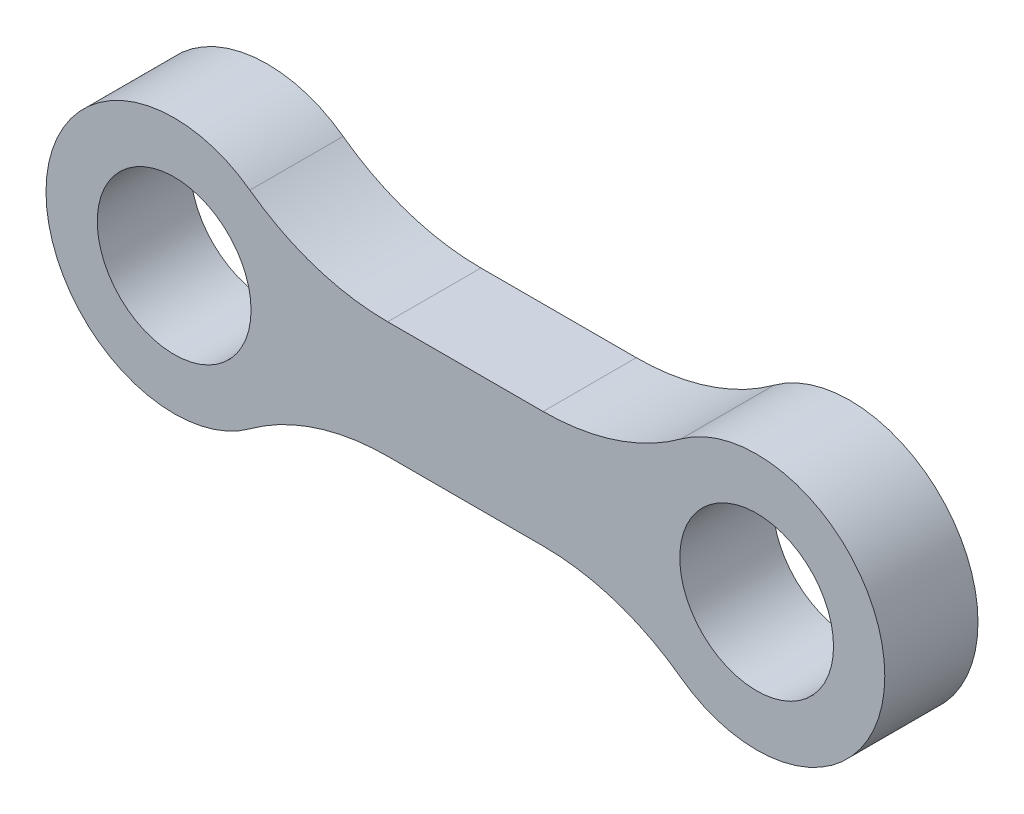
ISO-10303-21;
HEADER;
FILE_DESCRIPTION(('STEP AP214'),'2;1');
FILE_NAME('part.step','',(''),(''),'','','');
FILE_SCHEMA(('AUTOMOTIVE_DESIGN { 1 0 10303 214 1 1 1 1 }'));
ENDSEC;
DATA;
#1=APPLICATION_CONTEXT('core data for automotive mechanical design processes');
#2=APPLICATION_PROTOCOL_DEFINITION('international standard','automotive_design',2000,#1);
#3=PRODUCT_CONTEXT('',#1,'mechanical');
#4=PRODUCT('Part','Part','',(#3));
#5=PRODUCT_RELATED_PRODUCT_CATEGORY('part','',(#4));
#6=PRODUCT_DEFINITION_FORMATION('','',#4);
#7=PRODUCT_DEFINITION_CONTEXT('part definition',#1,'design');
#8=PRODUCT_DEFINITION('design','',#6,#7);
#9=PRODUCT_DEFINITION_SHAPE('','',#8);
#10=(LENGTH_UNIT() NAMED_UNIT(*) SI_UNIT(.MILLI.,.METRE.));
#11=(NAMED_UNIT(*) PLANE_ANGLE_UNIT() SI_UNIT($,.RADIAN.));
#12=(NAMED_UNIT(*) SI_UNIT($,.STERADIAN.) SOLID_ANGLE_UNIT());
#13=UNCERTAINTY_MEASURE_WITH_UNIT(LENGTH_MEASURE(1.E-05),#10,'distance_accuracy_value','');
#14=(GEOMETRIC_REPRESENTATION_CONTEXT(3) GLOBAL_UNCERTAINTY_ASSIGNED_CONTEXT((#13)) GLOBAL_UNIT_ASSIGNED_CONTEXT((#10,
#11,#12)) REPRESENTATION_CONTEXT('',''));
#15=CARTESIAN_POINT('',(0.,0.,0.));
#16=DIRECTION('',(0.,0.,1.));
#17=DIRECTION('',(1.,0.,0.));
#18=AXIS2_PLACEMENT_3D('',#15,#16,#17);
#19=CARTESIAN_POINT('',(-2.5,2.5,-4.));
#20=DIRECTION('',(0.,0.,1.));
#21=DIRECTION('',(1.,0.,0.));
#22=AXIS2_PLACEMENT_3D('',#19,#20,#21);
#23=CYLINDRICAL_SURFACE('',#22,5.5);
#24=CARTESIAN_POINT('',(-2.5,2.5,0.));
#25=DIRECTION('',(0.,0.,1.));
#26=DIRECTION('',(1.,0.,0.));
#27=AXIS2_PLACEMENT_3D('',#24,#25,#26);
#28=CIRCLE('',#27,5.5);
#29=CARTESIAN_POINT('',(-5.75215049319447,-1.93548387096774,0.));
#30=VERTEX_POINT('',#29);
#31=CARTESIAN_POINT('',(-5.75215049319447,6.93548387096774,0.));
#32=VERTEX_POINT('',#31);
#33=EDGE_CURVE('E215',#30,#32,#28,.T.);
#34=ORIENTED_EDGE('',*,*,#33,.F.);
#35=DIRECTION('',(0.,0.,1.));
#36=VECTOR('',#35,1.);
#37=CARTESIAN_POINT('',(-5.75215049319447,-1.93548387096774,-4.));
#38=LINE('',#37,#36);
#39=CARTESIAN_POINT('',(-5.75215049319447,-1.93548387096774,-4.));
#40=VERTEX_POINT('',#39);
#41=EDGE_CURVE('E112',#30,#40,#38,.F.);
#42=ORIENTED_EDGE('',*,*,#41,.T.);
#43=CARTESIAN_POINT('',(-2.5,2.5,-4.));
#44=DIRECTION('',(0.,0.,1.));
#45=DIRECTION('',(1.,0.,0.));
#46=AXIS2_PLACEMENT_3D('',#43,#44,#45);
#47=CIRCLE('',#46,5.5);
#48=CARTESIAN_POINT('',(-5.75215049319447,6.93548387096774,-4.));
#49=VERTEX_POINT('',#48);
#50=EDGE_CURVE('E197',#40,#49,#47,.T.);
#51=ORIENTED_EDGE('',*,*,#50,.T.);
#52=DIRECTION('',(0.,0.,1.));
#53=VECTOR('',#52,1.);
#54=CARTESIAN_POINT('',(-5.75215049319447,6.93548387096774,-4.));
#55=LINE('',#54,#53);
#56=EDGE_CURVE('E129',#49,#32,#55,.T.);
#57=ORIENTED_EDGE('',*,*,#56,.T.);
#58=EDGE_LOOP('',(#34,#42,#51,#57));
#59=FACE_BOUND('',#58,.T.);
#60=ADVANCED_FACE('F41',(#59),#23,.T.);
#61=CARTESIAN_POINT('',(0.,0.,-4.));
#62=DIRECTION('',(0.,1.,0.));
#63=DIRECTION('',(-1.,0.,0.));
#64=AXIS2_PLACEMENT_3D('',#61,#62,#63);
#65=PLANE('',#64);
#66=DIRECTION('',(-1.,0.,0.));
#67=VECTOR('',#66,1.);
#68=CARTESIAN_POINT('',(0.,0.,-4.));
#69=LINE('',#68,#67);
#70=CARTESIAN_POINT('',(-11.6651513899117,0.,-4.));
#71=VERTEX_POINT('',#70);
#72=CARTESIAN_POINT('',(-18.3348486100883,0.,-4.));
#73=VERTEX_POINT('',#72);
#74=EDGE_CURVE('E127',#71,#73,#69,.T.);
#75=ORIENTED_EDGE('',*,*,#74,.F.);
#76=DIRECTION('',(0.,0.,1.));
#77=VECTOR('',#76,1.);
#78=CARTESIAN_POINT('',(-11.6651513899117,0.,-4.));
#79=LINE('',#78,#77);
#80=CARTESIAN_POINT('',(-11.6651513899117,0.,0.));
#81=VERTEX_POINT('',#80);
#82=EDGE_CURVE('E111',#71,#81,#79,.T.);
#83=ORIENTED_EDGE('',*,*,#82,.T.);
#84=DIRECTION('',(-1.,0.,0.));
#85=VECTOR('',#84,1.);
#86=CARTESIAN_POINT('',(0.,0.,0.));
#87=LINE('',#86,#85);
#88=CARTESIAN_POINT('',(-18.3348486100883,0.,0.));
#89=VERTEX_POINT('',#88);
#90=EDGE_CURVE('E124',#81,#89,#87,.T.);
#91=ORIENTED_EDGE('',*,*,#90,.T.);
#92=DIRECTION('',(0.,0.,1.));
#93=VECTOR('',#92,1.);
#94=CARTESIAN_POINT('',(-18.3348486100883,0.,-4.));
#95=LINE('',#94,#93);
#96=EDGE_CURVE('E130',#89,#73,#95,.F.);
#97=ORIENTED_EDGE('',*,*,#96,.T.);
#98=EDGE_LOOP('',(#75,#83,#91,#97));
#99=FACE_BOUND('',#98,.T.);
#100=ADVANCED_FACE('F123',(#99),#65,.F.);
#101=CARTESIAN_POINT('',(-27.5,2.49999999999999,-4.));
#102=DIRECTION('',(0.,0.,1.));
#103=DIRECTION('',(1.,0.,0.));
#104=AXIS2_PLACEMENT_3D('',#101,#102,#103);
#105=CYLINDRICAL_SURFACE('',#104,5.5);
#106=CARTESIAN_POINT('',(-27.5,2.49999999999999,-4.));
#107=DIRECTION('',(0.,0.,1.));
#108=DIRECTION('',(1.,0.,0.));
#109=AXIS2_PLACEMENT_3D('',#106,#107,#108);
#110=CIRCLE('',#109,5.5);
#111=CARTESIAN_POINT('',(-24.2478495068055,6.93548387096774,-4.));
#112=VERTEX_POINT('',#111);
#113=CARTESIAN_POINT('',(-24.2478495068055,-1.93548387096774,-4.));
#114=VERTEX_POINT('',#113);
#115=EDGE_CURVE('E196',#112,#114,#110,.T.);
#116=ORIENTED_EDGE('',*,*,#115,.T.);
#117=DIRECTION('',(0.,0.,1.));
#118=VECTOR('',#117,1.);
#119=CARTESIAN_POINT('',(-24.2478495068055,-1.93548387096774,-4.));
#120=LINE('',#119,#118);
#121=CARTESIAN_POINT('',(-24.2478495068055,-1.93548387096774,0.));
#122=VERTEX_POINT('',#121);
#123=EDGE_CURVE('E160',#114,#122,#120,.T.);
#124=ORIENTED_EDGE('',*,*,#123,.T.);
#125=CARTESIAN_POINT('',(-27.5,2.49999999999999,0.));
#126=DIRECTION('',(0.,0.,1.));
#127=DIRECTION('',(1.,0.,0.));
#128=AXIS2_PLACEMENT_3D('',#125,#126,#127);
#129=CIRCLE('',#128,5.5);
#130=CARTESIAN_POINT('',(-24.2478495068055,6.93548387096774,0.));
#131=VERTEX_POINT('',#130);
#132=EDGE_CURVE('E138',#131,#122,#129,.T.);
#133=ORIENTED_EDGE('',*,*,#132,.F.);
#134=DIRECTION('',(0.,0.,1.));
#135=VECTOR('',#134,1.);
#136=CARTESIAN_POINT('',(-24.2478495068055,6.93548387096774,-4.));
#137=LINE('',#136,#135);
#138=EDGE_CURVE('E157',#131,#112,#137,.F.);
#139=ORIENTED_EDGE('',*,*,#138,.T.);
#140=EDGE_LOOP('',(#116,#124,#133,#139));
#141=FACE_BOUND('',#140,.T.);
#142=ADVANCED_FACE('F190',(#141),#105,.T.);
#143=CARTESIAN_POINT('',(0.,5.,-4.));
#144=DIRECTION('',(0.,1.,0.));
#145=DIRECTION('',(0.,0.,1.));
#146=AXIS2_PLACEMENT_3D('',#143,#144,#145);
#147=PLANE('',#146);
#148=DIRECTION('',(-1.,0.,0.));
#149=VECTOR('',#148,1.);
#150=CARTESIAN_POINT('',(0.,5.,0.));
#151=LINE('',#150,#149);
#152=CARTESIAN_POINT('',(-11.6651513899117,5.,0.));
#153=VERTEX_POINT('',#152);
#154=CARTESIAN_POINT('',(-18.3348486100883,5.,0.));
#155=VERTEX_POINT('',#154);
#156=EDGE_CURVE('E145',#153,#155,#151,.T.);
#157=ORIENTED_EDGE('',*,*,#156,.F.);
#158=DIRECTION('',(0.,0.,-1.));
#159=VECTOR('',#158,1.);
#160=CARTESIAN_POINT('',(-11.6651513899117,5.,-4.));
#161=LINE('',#160,#159);
#162=CARTESIAN_POINT('',(-11.6651513899117,5.,-4.));
#163=VERTEX_POINT('',#162);
#164=EDGE_CURVE('E62',#153,#163,#161,.T.);
#165=ORIENTED_EDGE('',*,*,#164,.T.);
#166=DIRECTION('',(-1.,0.,0.));
#167=VECTOR('',#166,1.);
#168=CARTESIAN_POINT('',(0.,5.,-4.));
#169=LINE('',#168,#167);
#170=CARTESIAN_POINT('',(-18.3348486100883,5.,-4.));
#171=VERTEX_POINT('',#170);
#172=EDGE_CURVE('E193',#163,#171,#169,.T.);
#173=ORIENTED_EDGE('',*,*,#172,.T.);
#174=DIRECTION('',(0.,0.,-1.));
#175=VECTOR('',#174,1.);
#176=CARTESIAN_POINT('',(-18.3348486100883,5.,0.));
#177=LINE('',#176,#175);
#178=EDGE_CURVE('E164',#171,#155,#177,.F.);
#179=ORIENTED_EDGE('',*,*,#178,.T.);
#180=EDGE_LOOP('',(#157,#165,#173,#179));
#181=FACE_BOUND('',#180,.T.);
#182=ADVANCED_FACE('F192',(#181),#147,.T.);
#183=CARTESIAN_POINT('',(-27.5,2.49999999999999,-4.));
#184=DIRECTION('',(0.,0.,1.));
#185=DIRECTION('',(1.,0.,0.));
#186=AXIS2_PLACEMENT_3D('',#183,#184,#185);
#187=CYLINDRICAL_SURFACE('',#186,3.3);
#188=CARTESIAN_POINT('',(-27.5,2.49999999999999,-4.));
#189=DIRECTION('',(0.,0.,1.));
#190=DIRECTION('',(1.,0.,0.));
#191=AXIS2_PLACEMENT_3D('',#188,#189,#190);
#192=CIRCLE('',#191,3.3);
#193=CARTESIAN_POINT('',(-24.2,2.49999999999999,-4.));
#194=VERTEX_POINT('',#193);
#195=EDGE_CURVE('E143',#194,#194,#192,.T.);
#196=ORIENTED_EDGE('',*,*,#195,.F.);
#197=EDGE_LOOP('',(#196));
#198=FACE_BOUND('',#197,.T.);
#199=CARTESIAN_POINT('',(-27.5,2.49999999999999,0.));
#200=DIRECTION('',(0.,0.,1.));
#201=DIRECTION('',(1.,0.,0.));
#202=AXIS2_PLACEMENT_3D('',#199,#200,#201);
#203=CIRCLE('',#202,3.3);
#204=CARTESIAN_POINT('',(-24.2,2.49999999999999,0.));
#205=VERTEX_POINT('',#204);
#206=EDGE_CURVE('E211',#205,#205,#203,.T.);
#207=ORIENTED_EDGE('',*,*,#206,.T.);
#208=EDGE_LOOP('',(#207));
#209=FACE_BOUND('',#208,.T.);
#210=ADVANCED_FACE('F244',(#198,#209),#187,.F.);
#211=CARTESIAN_POINT('',(-2.5,2.5,-4.));
#212=DIRECTION('',(0.,0.,1.));
#213=DIRECTION('',(1.,0.,0.));
#214=AXIS2_PLACEMENT_3D('',#211,#212,#213);
#215=CYLINDRICAL_SURFACE('',#214,3.3);
#216=CARTESIAN_POINT('',(-2.5,2.5,-4.));
#217=DIRECTION('',(0.,0.,1.));
#218=DIRECTION('',(1.,0.,0.));
#219=AXIS2_PLACEMENT_3D('',#216,#217,#218);
#220=CIRCLE('',#219,3.3);
#221=CARTESIAN_POINT('',(0.8,2.5,-4.));
#222=VERTEX_POINT('',#221);
#223=EDGE_CURVE('E150',#222,#222,#220,.T.);
#224=ORIENTED_EDGE('',*,*,#223,.F.);
#225=EDGE_LOOP('',(#224));
#226=FACE_BOUND('',#225,.T.);
#227=CARTESIAN_POINT('',(-2.5,2.5,0.));
#228=DIRECTION('',(0.,0.,1.));
#229=DIRECTION('',(1.,0.,0.));
#230=AXIS2_PLACEMENT_3D('',#227,#228,#229);
#231=CIRCLE('',#230,3.3);
#232=CARTESIAN_POINT('',(0.8,2.5,0.));
#233=VERTEX_POINT('',#232);
#234=EDGE_CURVE('E137',#233,#233,#231,.T.);
#235=ORIENTED_EDGE('',*,*,#234,.T.);
#236=EDGE_LOOP('',(#235));
#237=FACE_BOUND('',#236,.T.);
#238=ADVANCED_FACE('F246',(#226,#237),#215,.F.);
#239=CARTESIAN_POINT('',(0.,0.,-4.));
#240=DIRECTION('',(0.,0.,1.));
#241=DIRECTION('',(1.,0.,0.));
#242=AXIS2_PLACEMENT_3D('',#239,#240,#241);
#243=PLANE('',#242);
#244=ORIENTED_EDGE('',*,*,#195,.T.);
#245=EDGE_LOOP('',(#244));
#246=FACE_BOUND('',#245,.T.);
#247=ORIENTED_EDGE('',*,*,#50,.F.);
#248=CARTESIAN_POINT('',(-11.6651513899117,-10.,-4.));
#249=DIRECTION('',(0.,0.,1.));
#250=DIRECTION('',(1.,0.,0.));
#251=AXIS2_PLACEMENT_3D('',#248,#249,#250);
#252=CIRCLE('',#251,10.);
#253=EDGE_CURVE('E118',#40,#71,#252,.T.);
#254=ORIENTED_EDGE('',*,*,#253,.T.);
#255=ORIENTED_EDGE('',*,*,#74,.T.);
#256=CARTESIAN_POINT('',(-18.3348486100883,-10.,-4.));
#257=DIRECTION('',(0.,0.,1.));
#258=DIRECTION('',(1.,0.,0.));
#259=AXIS2_PLACEMENT_3D('',#256,#257,#258);
#260=CIRCLE('',#259,10.);
#261=EDGE_CURVE('E174',#73,#114,#260,.T.);
#262=ORIENTED_EDGE('',*,*,#261,.T.);
#263=ORIENTED_EDGE('',*,*,#115,.F.);
#264=CARTESIAN_POINT('',(-18.3348486100883,15.,-4.));
#265=DIRECTION('',(0.,0.,1.));
#266=DIRECTION('',(1.,0.,0.));
#267=AXIS2_PLACEMENT_3D('',#264,#265,#266);
#268=CIRCLE('',#267,10.);
#269=EDGE_CURVE('E11',#112,#171,#268,.T.);
#270=ORIENTED_EDGE('',*,*,#269,.T.);
#271=ORIENTED_EDGE('',*,*,#172,.F.);
#272=CARTESIAN_POINT('',(-11.6651513899117,15.,-4.));
#273=DIRECTION('',(0.,0.,1.));
#274=DIRECTION('',(1.,0.,0.));
#275=AXIS2_PLACEMENT_3D('',#272,#273,#274);
#276=CIRCLE('',#275,10.);
#277=EDGE_CURVE('E180',#163,#49,#276,.T.);
#278=ORIENTED_EDGE('',*,*,#277,.T.);
#279=EDGE_LOOP('',(#247,#254,#255,#262,#263,#270,#271,#278));
#280=FACE_BOUND('',#279,.T.);
#281=ORIENTED_EDGE('',*,*,#223,.T.);
#282=EDGE_LOOP('',(#281));
#283=FACE_BOUND('',#282,.T.);
#284=ADVANCED_FACE('F223',(#246,#280,#283),#243,.F.);
#285=CARTESIAN_POINT('',(0.,0.,0.));
#286=DIRECTION('',(0.,0.,1.));
#287=DIRECTION('',(1.,0.,0.));
#288=AXIS2_PLACEMENT_3D('',#285,#286,#287);
#289=PLANE('',#288);
#290=ORIENTED_EDGE('',*,*,#206,.F.);
#291=EDGE_LOOP('',(#290));
#292=FACE_BOUND('',#291,.T.);
#293=ORIENTED_EDGE('',*,*,#90,.F.);
#294=CARTESIAN_POINT('',(-11.6651513899117,-10.,0.));
#295=DIRECTION('',(0.,0.,1.));
#296=DIRECTION('',(1.,0.,0.));
#297=AXIS2_PLACEMENT_3D('',#294,#295,#296);
#298=CIRCLE('',#297,10.);
#299=EDGE_CURVE('E107',#81,#30,#298,.F.);
#300=ORIENTED_EDGE('',*,*,#299,.T.);
#301=ORIENTED_EDGE('',*,*,#33,.T.);
#302=CARTESIAN_POINT('',(-11.6651513899117,15.,0.));
#303=DIRECTION('',(0.,0.,1.));
#304=DIRECTION('',(1.,0.,0.));
#305=AXIS2_PLACEMENT_3D('',#302,#303,#304);
#306=CIRCLE('',#305,10.);
#307=EDGE_CURVE('E177',#32,#153,#306,.F.);
#308=ORIENTED_EDGE('',*,*,#307,.T.);
#309=ORIENTED_EDGE('',*,*,#156,.T.);
#310=CARTESIAN_POINT('',(-18.3348486100883,15.,0.));
#311=DIRECTION('',(0.,0.,1.));
#312=DIRECTION('',(1.,0.,0.));
#313=AXIS2_PLACEMENT_3D('',#310,#311,#312);
#314=CIRCLE('',#313,10.);
#315=EDGE_CURVE('E50',#155,#131,#314,.F.);
#316=ORIENTED_EDGE('',*,*,#315,.T.);
#317=ORIENTED_EDGE('',*,*,#132,.T.);
#318=CARTESIAN_POINT('',(-18.3348486100883,-10.,0.));
#319=DIRECTION('',(0.,0.,1.));
#320=DIRECTION('',(1.,0.,0.));
#321=AXIS2_PLACEMENT_3D('',#318,#319,#320);
#322=CIRCLE('',#321,10.);
#323=EDGE_CURVE('E135',#122,#89,#322,.F.);
#324=ORIENTED_EDGE('',*,*,#323,.T.);
#325=EDGE_LOOP('',(#293,#300,#301,#308,#309,#316,#317,#324));
#326=FACE_BOUND('',#325,.T.);
#327=ORIENTED_EDGE('',*,*,#234,.F.);
#328=EDGE_LOOP('',(#327));
#329=FACE_BOUND('',#328,.T.);
#330=ADVANCED_FACE('F132',(#292,#326,#329),#289,.T.);
#331=CARTESIAN_POINT('',(-11.6651513899117,-10.,-4.));
#332=DIRECTION('',(0.,0.,1.));
#333=DIRECTION('',(1.,0.,0.));
#334=AXIS2_PLACEMENT_3D('',#331,#332,#333);
#335=CYLINDRICAL_SURFACE('',#334,10.);
#336=ORIENTED_EDGE('',*,*,#253,.F.);
#337=ORIENTED_EDGE('',*,*,#41,.F.);
#338=ORIENTED_EDGE('',*,*,#299,.F.);
#339=ORIENTED_EDGE('',*,*,#82,.F.);
#340=EDGE_LOOP('',(#336,#337,#338,#339));
#341=FACE_BOUND('',#340,.T.);
#342=ADVANCED_FACE('F110',(#341),#335,.F.);
#343=CARTESIAN_POINT('',(-18.3348486100883,-10.,-4.));
#344=DIRECTION('',(0.,0.,1.));
#345=DIRECTION('',(1.,0.,0.));
#346=AXIS2_PLACEMENT_3D('',#343,#344,#345);
#347=CYLINDRICAL_SURFACE('',#346,10.);
#348=ORIENTED_EDGE('',*,*,#261,.F.);
#349=ORIENTED_EDGE('',*,*,#96,.F.);
#350=ORIENTED_EDGE('',*,*,#323,.F.);
#351=ORIENTED_EDGE('',*,*,#123,.F.);
#352=EDGE_LOOP('',(#348,#349,#350,#351));
#353=FACE_BOUND('',#352,.T.);
#354=ADVANCED_FACE('F227',(#353),#347,.F.);
#355=CARTESIAN_POINT('',(-11.6651513899117,15.,-4.));
#356=DIRECTION('',(0.,0.,1.));
#357=DIRECTION('',(1.,0.,0.));
#358=AXIS2_PLACEMENT_3D('',#355,#356,#357);
#359=CYLINDRICAL_SURFACE('',#358,10.);
#360=ORIENTED_EDGE('',*,*,#277,.F.);
#361=ORIENTED_EDGE('',*,*,#164,.F.);
#362=ORIENTED_EDGE('',*,*,#307,.F.);
#363=ORIENTED_EDGE('',*,*,#56,.F.);
#364=EDGE_LOOP('',(#360,#361,#362,#363));
#365=FACE_BOUND('',#364,.T.);
#366=ADVANCED_FACE('F222',(#365),#359,.F.);
#367=CARTESIAN_POINT('',(-18.3348486100883,15.,-4.));
#368=DIRECTION('',(0.,0.,1.));
#369=DIRECTION('',(1.,0.,0.));
#370=AXIS2_PLACEMENT_3D('',#367,#368,#369);
#371=CYLINDRICAL_SURFACE('',#370,10.);
#372=ORIENTED_EDGE('',*,*,#269,.F.);
#373=ORIENTED_EDGE('',*,*,#138,.F.);
#374=ORIENTED_EDGE('',*,*,#315,.F.);
#375=ORIENTED_EDGE('',*,*,#178,.F.);
#376=EDGE_LOOP('',(#372,#373,#374,#375));
#377=FACE_BOUND('',#376,.T.);
#378=ADVANCED_FACE('F43',(#377),#371,.F.);
#379=CLOSED_SHELL('',(#60,#100,#142,#182,#210,#238,#284,#330,#342,#354,#366,#378));
#380=MANIFOLD_SOLID_BREP('B2',#379);
#381=ADVANCED_BREP_SHAPE_REPRESENTATION('',(#18,#380),#14);
#382=SHAPE_DEFINITION_REPRESENTATION(#9,#381);
ENDSEC;
END-ISO-10303-21;
